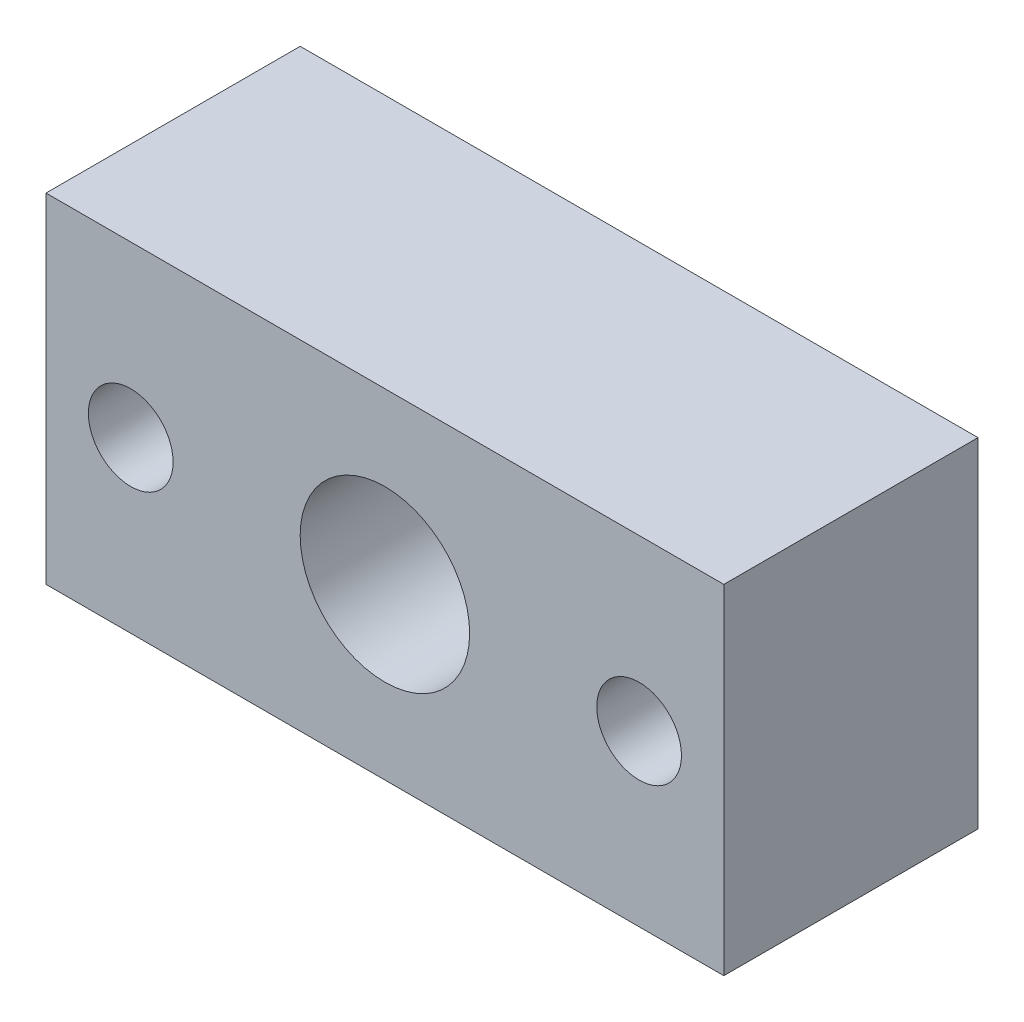
ISO-10303-21;
HEADER;
FILE_DESCRIPTION(('STEP AP214'),'2;1');
FILE_NAME('part.step','',(''),(''),'','','');
FILE_SCHEMA(('AUTOMOTIVE_DESIGN { 1 0 10303 214 1 1 1 1 }'));
ENDSEC;
DATA;
#1=APPLICATION_CONTEXT('core data for automotive mechanical design processes');
#2=APPLICATION_PROTOCOL_DEFINITION('international standard','automotive_design',2000,#1);
#3=PRODUCT_CONTEXT('',#1,'mechanical');
#4=PRODUCT('Part','Part','',(#3));
#5=PRODUCT_RELATED_PRODUCT_CATEGORY('part','',(#4));
#6=PRODUCT_DEFINITION_FORMATION('','',#4);
#7=PRODUCT_DEFINITION_CONTEXT('part definition',#1,'design');
#8=PRODUCT_DEFINITION('design','',#6,#7);
#9=PRODUCT_DEFINITION_SHAPE('','',#8);
#10=(LENGTH_UNIT() NAMED_UNIT(*) SI_UNIT(.MILLI.,.METRE.));
#11=(NAMED_UNIT(*) PLANE_ANGLE_UNIT() SI_UNIT($,.RADIAN.));
#12=(NAMED_UNIT(*) SI_UNIT($,.STERADIAN.) SOLID_ANGLE_UNIT());
#13=UNCERTAINTY_MEASURE_WITH_UNIT(LENGTH_MEASURE(1.E-05),#10,'distance_accuracy_value','');
#14=(GEOMETRIC_REPRESENTATION_CONTEXT(3) GLOBAL_UNCERTAINTY_ASSIGNED_CONTEXT((#13)) GLOBAL_UNIT_ASSIGNED_CONTEXT((#10,
#11,#12)) REPRESENTATION_CONTEXT('',''));
#15=CARTESIAN_POINT('',(0.,0.,0.));
#16=DIRECTION('',(0.,0.,1.));
#17=DIRECTION('',(1.,0.,0.));
#18=AXIS2_PLACEMENT_3D('',#15,#16,#17);
#19=CARTESIAN_POINT('',(0.,0.,15.));
#20=DIRECTION('',(0.,0.,-1.));
#21=DIRECTION('',(-1.,0.,0.));
#22=AXIS2_PLACEMENT_3D('',#19,#20,#21);
#23=PLANE('',#22);
#24=DIRECTION('',(0.,-1.,0.));
#25=VECTOR('',#24,1.);
#26=CARTESIAN_POINT('',(0.,0.,15.));
#27=LINE('',#26,#25);
#28=CARTESIAN_POINT('',(0.,20.,15.));
#29=VERTEX_POINT('',#28);
#30=CARTESIAN_POINT('',(0.,0.,15.));
#31=VERTEX_POINT('',#30);
#32=EDGE_CURVE('E89',#29,#31,#27,.T.);
#33=ORIENTED_EDGE('',*,*,#32,.T.);
#34=DIRECTION('',(1.,0.,0.));
#35=VECTOR('',#34,1.);
#36=CARTESIAN_POINT('',(0.,0.,15.));
#37=LINE('',#36,#35);
#38=CARTESIAN_POINT('',(40.,0.,15.));
#39=VERTEX_POINT('',#38);
#40=EDGE_CURVE('E84',#31,#39,#37,.T.);
#41=ORIENTED_EDGE('',*,*,#40,.T.);
#42=DIRECTION('',(0.,1.,0.));
#43=VECTOR('',#42,1.);
#44=CARTESIAN_POINT('',(40.,0.,15.));
#45=LINE('',#44,#43);
#46=CARTESIAN_POINT('',(40.,20.,15.));
#47=VERTEX_POINT('',#46);
#48=EDGE_CURVE('E87',#39,#47,#45,.T.);
#49=ORIENTED_EDGE('',*,*,#48,.T.);
#50=DIRECTION('',(-1.,0.,0.));
#51=VECTOR('',#50,1.);
#52=CARTESIAN_POINT('',(0.,20.,15.));
#53=LINE('',#52,#51);
#54=EDGE_CURVE('E54',#47,#29,#53,.T.);
#55=ORIENTED_EDGE('',*,*,#54,.T.);
#56=EDGE_LOOP('',(#33,#41,#49,#55));
#57=FACE_BOUND('',#56,.T.);
#58=CARTESIAN_POINT('',(20.,10.,15.));
#59=DIRECTION('',(0.,0.,1.));
#60=DIRECTION('',(1.,0.,0.));
#61=AXIS2_PLACEMENT_3D('',#58,#59,#60);
#62=CIRCLE('',#61,4.99999999999999);
#63=CARTESIAN_POINT('',(25.,10.,15.));
#64=VERTEX_POINT('',#63);
#65=EDGE_CURVE('E104',#64,#64,#62,.T.);
#66=ORIENTED_EDGE('',*,*,#65,.F.);
#67=EDGE_LOOP('',(#66));
#68=FACE_BOUND('',#67,.T.);
#69=CARTESIAN_POINT('',(35.,10.,15.));
#70=DIRECTION('',(0.,0.,1.));
#71=DIRECTION('',(1.,0.,0.));
#72=AXIS2_PLACEMENT_3D('',#69,#70,#71);
#73=CIRCLE('',#72,2.49999999999999);
#74=CARTESIAN_POINT('',(37.5,10.,15.));
#75=VERTEX_POINT('',#74);
#76=EDGE_CURVE('E119',#75,#75,#73,.T.);
#77=ORIENTED_EDGE('',*,*,#76,.F.);
#78=EDGE_LOOP('',(#77));
#79=FACE_BOUND('',#78,.T.);
#80=CARTESIAN_POINT('',(5.,10.,15.));
#81=DIRECTION('',(0.,0.,1.));
#82=DIRECTION('',(1.,0.,0.));
#83=AXIS2_PLACEMENT_3D('',#80,#81,#82);
#84=CIRCLE('',#83,2.49999999999999);
#85=CARTESIAN_POINT('',(7.49999999999999,10.,15.));
#86=VERTEX_POINT('',#85);
#87=EDGE_CURVE('E125',#86,#86,#84,.T.);
#88=ORIENTED_EDGE('',*,*,#87,.F.);
#89=EDGE_LOOP('',(#88));
#90=FACE_BOUND('',#89,.T.);
#91=ADVANCED_FACE('F37',(#57,#68,#79,#90),#23,.F.);
#92=CARTESIAN_POINT('',(0.,0.,0.));
#93=DIRECTION('',(0.,0.,-1.));
#94=DIRECTION('',(-1.,0.,0.));
#95=AXIS2_PLACEMENT_3D('',#92,#93,#94);
#96=PLANE('',#95);
#97=CARTESIAN_POINT('',(35.,10.,0.));
#98=DIRECTION('',(0.,0.,1.));
#99=DIRECTION('',(1.,0.,0.));
#100=AXIS2_PLACEMENT_3D('',#97,#98,#99);
#101=CIRCLE('',#100,2.49999999999999);
#102=CARTESIAN_POINT('',(37.5,10.,0.));
#103=VERTEX_POINT('',#102);
#104=EDGE_CURVE('E122',#103,#103,#101,.T.);
#105=ORIENTED_EDGE('',*,*,#104,.T.);
#106=EDGE_LOOP('',(#105));
#107=FACE_BOUND('',#106,.T.);
#108=DIRECTION('',(0.,-1.,0.));
#109=VECTOR('',#108,1.);
#110=CARTESIAN_POINT('',(0.,0.,0.));
#111=LINE('',#110,#109);
#112=CARTESIAN_POINT('',(0.,20.,0.));
#113=VERTEX_POINT('',#112);
#114=CARTESIAN_POINT('',(0.,0.,0.));
#115=VERTEX_POINT('',#114);
#116=EDGE_CURVE('E101',#113,#115,#111,.T.);
#117=ORIENTED_EDGE('',*,*,#116,.F.);
#118=DIRECTION('',(-1.,0.,0.));
#119=VECTOR('',#118,1.);
#120=CARTESIAN_POINT('',(0.,20.,0.));
#121=LINE('',#120,#119);
#122=CARTESIAN_POINT('',(40.,20.,0.));
#123=VERTEX_POINT('',#122);
#124=EDGE_CURVE('E77',#123,#113,#121,.T.);
#125=ORIENTED_EDGE('',*,*,#124,.F.);
#126=DIRECTION('',(0.,1.,0.));
#127=VECTOR('',#126,1.);
#128=CARTESIAN_POINT('',(40.,0.,0.));
#129=LINE('',#128,#127);
#130=CARTESIAN_POINT('',(40.,0.,0.));
#131=VERTEX_POINT('',#130);
#132=EDGE_CURVE('E71',#131,#123,#129,.T.);
#133=ORIENTED_EDGE('',*,*,#132,.F.);
#134=DIRECTION('',(1.,0.,0.));
#135=VECTOR('',#134,1.);
#136=CARTESIAN_POINT('',(0.,0.,0.));
#137=LINE('',#136,#135);
#138=EDGE_CURVE('E93',#115,#131,#137,.T.);
#139=ORIENTED_EDGE('',*,*,#138,.F.);
#140=EDGE_LOOP('',(#117,#125,#133,#139));
#141=FACE_BOUND('',#140,.T.);
#142=CARTESIAN_POINT('',(20.,10.,0.));
#143=DIRECTION('',(0.,0.,1.));
#144=DIRECTION('',(1.,0.,0.));
#145=AXIS2_PLACEMENT_3D('',#142,#143,#144);
#146=CIRCLE('',#145,4.99999999999999);
#147=CARTESIAN_POINT('',(25.,10.,0.));
#148=VERTEX_POINT('',#147);
#149=EDGE_CURVE('E116',#148,#148,#146,.T.);
#150=ORIENTED_EDGE('',*,*,#149,.T.);
#151=EDGE_LOOP('',(#150));
#152=FACE_BOUND('',#151,.T.);
#153=CARTESIAN_POINT('',(5.,10.,0.));
#154=DIRECTION('',(0.,0.,1.));
#155=DIRECTION('',(1.,0.,0.));
#156=AXIS2_PLACEMENT_3D('',#153,#154,#155);
#157=CIRCLE('',#156,2.49999999999999);
#158=CARTESIAN_POINT('',(7.49999999999999,10.,0.));
#159=VERTEX_POINT('',#158);
#160=EDGE_CURVE('E128',#159,#159,#157,.T.);
#161=ORIENTED_EDGE('',*,*,#160,.T.);
#162=EDGE_LOOP('',(#161));
#163=FACE_BOUND('',#162,.T.);
#164=ADVANCED_FACE('F112',(#107,#141,#152,#163),#96,.T.);
#165=CARTESIAN_POINT('',(0.,0.,15.));
#166=DIRECTION('',(1.,0.,0.));
#167=DIRECTION('',(0.,0.,-1.));
#168=AXIS2_PLACEMENT_3D('',#165,#166,#167);
#169=PLANE('',#168);
#170=ORIENTED_EDGE('',*,*,#116,.T.);
#171=DIRECTION('',(0.,0.,-1.));
#172=VECTOR('',#171,1.);
#173=CARTESIAN_POINT('',(0.,0.,15.));
#174=LINE('',#173,#172);
#175=EDGE_CURVE('E11',#31,#115,#174,.T.);
#176=ORIENTED_EDGE('',*,*,#175,.F.);
#177=ORIENTED_EDGE('',*,*,#32,.F.);
#178=DIRECTION('',(0.,0.,-1.));
#179=VECTOR('',#178,1.);
#180=CARTESIAN_POINT('',(0.,20.,15.));
#181=LINE('',#180,#179);
#182=EDGE_CURVE('E97',#29,#113,#181,.T.);
#183=ORIENTED_EDGE('',*,*,#182,.T.);
#184=EDGE_LOOP('',(#170,#176,#177,#183));
#185=FACE_BOUND('',#184,.T.);
#186=ADVANCED_FACE('F39',(#185),#169,.F.);
#187=CARTESIAN_POINT('',(0.,0.,15.));
#188=DIRECTION('',(0.,1.,0.));
#189=DIRECTION('',(0.,0.,1.));
#190=AXIS2_PLACEMENT_3D('',#187,#188,#189);
#191=PLANE('',#190);
#192=ORIENTED_EDGE('',*,*,#138,.T.);
#193=DIRECTION('',(0.,0.,-1.));
#194=VECTOR('',#193,1.);
#195=CARTESIAN_POINT('',(40.,0.,15.));
#196=LINE('',#195,#194);
#197=EDGE_CURVE('E46',#39,#131,#196,.T.);
#198=ORIENTED_EDGE('',*,*,#197,.F.);
#199=ORIENTED_EDGE('',*,*,#40,.F.);
#200=ORIENTED_EDGE('',*,*,#175,.T.);
#201=EDGE_LOOP('',(#192,#198,#199,#200));
#202=FACE_BOUND('',#201,.T.);
#203=ADVANCED_FACE('F92',(#202),#191,.F.);
#204=CARTESIAN_POINT('',(40.,0.,15.));
#205=DIRECTION('',(-1.,0.,0.));
#206=DIRECTION('',(0.,0.,1.));
#207=AXIS2_PLACEMENT_3D('',#204,#205,#206);
#208=PLANE('',#207);
#209=ORIENTED_EDGE('',*,*,#132,.T.);
#210=DIRECTION('',(0.,0.,-1.));
#211=VECTOR('',#210,1.);
#212=CARTESIAN_POINT('',(40.,20.,15.));
#213=LINE('',#212,#211);
#214=EDGE_CURVE('E94',#47,#123,#213,.T.);
#215=ORIENTED_EDGE('',*,*,#214,.F.);
#216=ORIENTED_EDGE('',*,*,#48,.F.);
#217=ORIENTED_EDGE('',*,*,#197,.T.);
#218=EDGE_LOOP('',(#209,#215,#216,#217));
#219=FACE_BOUND('',#218,.T.);
#220=ADVANCED_FACE('F95',(#219),#208,.F.);
#221=CARTESIAN_POINT('',(0.,20.,15.));
#222=DIRECTION('',(0.,-1.,0.));
#223=DIRECTION('',(0.,0.,-1.));
#224=AXIS2_PLACEMENT_3D('',#221,#222,#223);
#225=PLANE('',#224);
#226=ORIENTED_EDGE('',*,*,#124,.T.);
#227=ORIENTED_EDGE('',*,*,#182,.F.);
#228=ORIENTED_EDGE('',*,*,#54,.F.);
#229=ORIENTED_EDGE('',*,*,#214,.T.);
#230=EDGE_LOOP('',(#226,#227,#228,#229));
#231=FACE_BOUND('',#230,.T.);
#232=ADVANCED_FACE('F109',(#231),#225,.F.);
#233=CARTESIAN_POINT('',(20.,10.,15.));
#234=DIRECTION('',(0.,0.,-1.));
#235=DIRECTION('',(-1.,0.,0.));
#236=AXIS2_PLACEMENT_3D('',#233,#234,#235);
#237=CYLINDRICAL_SURFACE('',#236,4.99999999999999);
#238=ORIENTED_EDGE('',*,*,#65,.T.);
#239=EDGE_LOOP('',(#238));
#240=FACE_BOUND('',#239,.T.);
#241=ORIENTED_EDGE('',*,*,#149,.F.);
#242=EDGE_LOOP('',(#241));
#243=FACE_BOUND('',#242,.T.);
#244=ADVANCED_FACE('F145',(#240,#243),#237,.F.);
#245=CARTESIAN_POINT('',(35.,10.,15.));
#246=DIRECTION('',(0.,0.,-1.));
#247=DIRECTION('',(-1.,0.,0.));
#248=AXIS2_PLACEMENT_3D('',#245,#246,#247);
#249=CYLINDRICAL_SURFACE('',#248,2.49999999999999);
#250=ORIENTED_EDGE('',*,*,#76,.T.);
#251=EDGE_LOOP('',(#250));
#252=FACE_BOUND('',#251,.T.);
#253=ORIENTED_EDGE('',*,*,#104,.F.);
#254=EDGE_LOOP('',(#253));
#255=FACE_BOUND('',#254,.T.);
#256=ADVANCED_FACE('F191',(#252,#255),#249,.F.);
#257=CARTESIAN_POINT('',(5.,10.,15.));
#258=DIRECTION('',(0.,0.,-1.));
#259=DIRECTION('',(-1.,0.,0.));
#260=AXIS2_PLACEMENT_3D('',#257,#258,#259);
#261=CYLINDRICAL_SURFACE('',#260,2.49999999999999);
#262=ORIENTED_EDGE('',*,*,#87,.T.);
#263=EDGE_LOOP('',(#262));
#264=FACE_BOUND('',#263,.T.);
#265=ORIENTED_EDGE('',*,*,#160,.F.);
#266=EDGE_LOOP('',(#265));
#267=FACE_BOUND('',#266,.T.);
#268=ADVANCED_FACE('F134',(#264,#267),#261,.F.);
#269=CLOSED_SHELL('',(#91,#164,#186,#203,#220,#232,#244,#256,#268));
#270=MANIFOLD_SOLID_BREP('B2',#269);
#271=ADVANCED_BREP_SHAPE_REPRESENTATION('',(#18,#270),#14);
#272=SHAPE_DEFINITION_REPRESENTATION(#9,#271);
ENDSEC;
END-ISO-10303-21;
